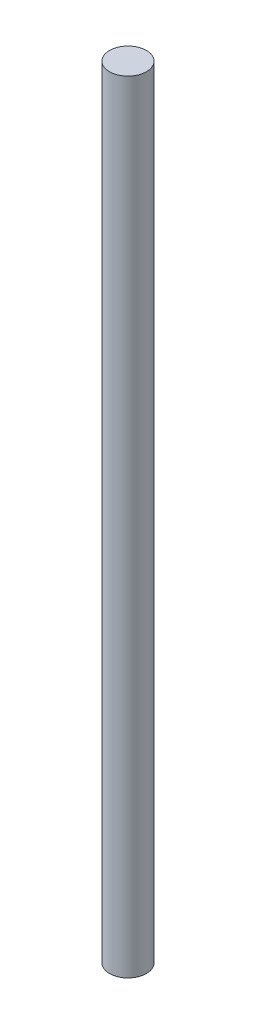
ISO-10303-21;
HEADER;
FILE_DESCRIPTION(('STEP AP214'),'2;1');
FILE_NAME('part.step','',(''),(''),'','','');
FILE_SCHEMA(('AUTOMOTIVE_DESIGN { 1 0 10303 214 1 1 1 1 }'));
ENDSEC;
DATA;
#1=APPLICATION_CONTEXT('core data for automotive mechanical design processes');
#2=APPLICATION_PROTOCOL_DEFINITION('international standard','automotive_design',2000,#1);
#3=PRODUCT_CONTEXT('',#1,'mechanical');
#4=PRODUCT('Part','Part','',(#3));
#5=PRODUCT_RELATED_PRODUCT_CATEGORY('part','',(#4));
#6=PRODUCT_DEFINITION_FORMATION('','',#4);
#7=PRODUCT_DEFINITION_CONTEXT('part definition',#1,'design');
#8=PRODUCT_DEFINITION('design','',#6,#7);
#9=PRODUCT_DEFINITION_SHAPE('','',#8);
#10=(LENGTH_UNIT() NAMED_UNIT(*) SI_UNIT(.MILLI.,.METRE.));
#11=(NAMED_UNIT(*) PLANE_ANGLE_UNIT() SI_UNIT($,.RADIAN.));
#12=(NAMED_UNIT(*) SI_UNIT($,.STERADIAN.) SOLID_ANGLE_UNIT());
#13=UNCERTAINTY_MEASURE_WITH_UNIT(LENGTH_MEASURE(1.E-05),#10,'distance_accuracy_value','');
#14=(GEOMETRIC_REPRESENTATION_CONTEXT(3) GLOBAL_UNCERTAINTY_ASSIGNED_CONTEXT((#13)) GLOBAL_UNIT_ASSIGNED_CONTEXT((#10,
#11,#12)) REPRESENTATION_CONTEXT('',''));
#15=CARTESIAN_POINT('',(0.,0.,0.));
#16=DIRECTION('',(0.,0.,1.));
#17=DIRECTION('',(1.,0.,0.));
#18=AXIS2_PLACEMENT_3D('',#15,#16,#17);
#19=CARTESIAN_POINT('',(0.,254.,0.));
#20=DIRECTION('',(0.,-1.,0.));
#21=DIRECTION('',(0.,0.,-1.));
#22=AXIS2_PLACEMENT_3D('',#19,#20,#21);
#23=CYLINDRICAL_SURFACE('',#22,6.);
#24=CARTESIAN_POINT('',(0.,254.,0.));
#25=DIRECTION('',(0.,1.,0.));
#26=DIRECTION('',(0.,0.,1.));
#27=AXIS2_PLACEMENT_3D('',#24,#25,#26);
#28=CIRCLE('',#27,6.);
#29=CARTESIAN_POINT('',(0.,254.,6.));
#30=VERTEX_POINT('',#29);
#31=EDGE_CURVE('E10',#30,#30,#28,.T.);
#32=ORIENTED_EDGE('',*,*,#31,.F.);
#33=EDGE_LOOP('',(#32));
#34=FACE_BOUND('',#33,.T.);
#35=CARTESIAN_POINT('',(0.,0.,0.));
#36=DIRECTION('',(0.,1.,0.));
#37=DIRECTION('',(0.,0.,1.));
#38=AXIS2_PLACEMENT_3D('',#35,#36,#37);
#39=CIRCLE('',#38,6.);
#40=CARTESIAN_POINT('',(0.,0.,6.));
#41=VERTEX_POINT('',#40);
#42=EDGE_CURVE('E44',#41,#41,#39,.T.);
#43=ORIENTED_EDGE('',*,*,#42,.T.);
#44=EDGE_LOOP('',(#43));
#45=FACE_BOUND('',#44,.T.);
#46=ADVANCED_FACE('F41',(#34,#45),#23,.T.);
#47=CARTESIAN_POINT('',(0.,254.,0.));
#48=DIRECTION('',(0.,1.,0.));
#49=DIRECTION('',(0.,0.,1.));
#50=AXIS2_PLACEMENT_3D('',#47,#48,#49);
#51=PLANE('',#50);
#52=ORIENTED_EDGE('',*,*,#31,.T.);
#53=EDGE_LOOP('',(#52));
#54=FACE_BOUND('',#53,.T.);
#55=ADVANCED_FACE('F58',(#54),#51,.T.);
#56=CARTESIAN_POINT('',(0.,0.,0.));
#57=DIRECTION('',(0.,1.,0.));
#58=DIRECTION('',(0.,0.,1.));
#59=AXIS2_PLACEMENT_3D('',#56,#57,#58);
#60=PLANE('',#59);
#61=ORIENTED_EDGE('',*,*,#42,.F.);
#62=EDGE_LOOP('',(#61));
#63=FACE_BOUND('',#62,.T.);
#64=ADVANCED_FACE('F56',(#63),#60,.F.);
#65=CLOSED_SHELL('',(#46,#55,#64));
#66=MANIFOLD_SOLID_BREP('B2',#65);
#67=ADVANCED_BREP_SHAPE_REPRESENTATION('',(#18,#66),#14);
#68=SHAPE_DEFINITION_REPRESENTATION(#9,#67);
ENDSEC;
END-ISO-10303-21;
